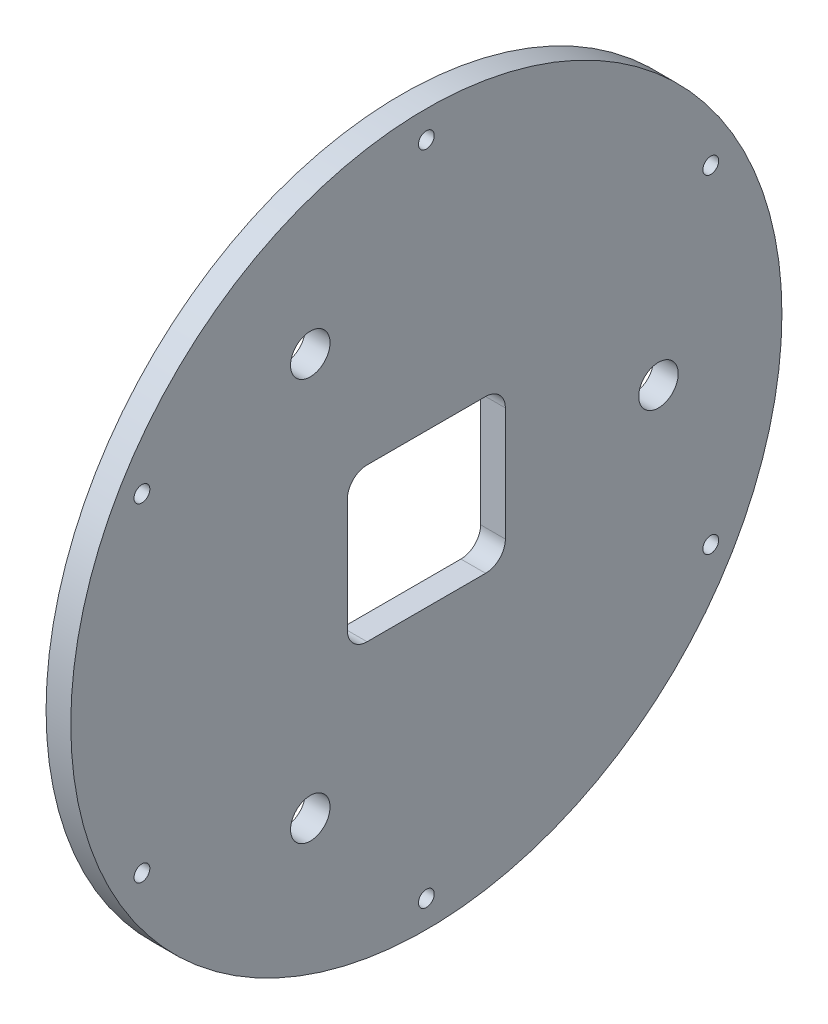
ISO-10303-21;
HEADER;
FILE_DESCRIPTION(('STEP AP214'),'2;1');
FILE_NAME('part.step','',(''),(''),'','','');
FILE_SCHEMA(('AUTOMOTIVE_DESIGN { 1 0 10303 214 1 1 1 1 }'));
ENDSEC;
DATA;
#1=APPLICATION_CONTEXT('core data for automotive mechanical design processes');
#2=APPLICATION_PROTOCOL_DEFINITION('international standard','automotive_design',2000,#1);
#3=PRODUCT_CONTEXT('',#1,'mechanical');
#4=PRODUCT('Part','Part','',(#3));
#5=PRODUCT_RELATED_PRODUCT_CATEGORY('part','',(#4));
#6=PRODUCT_DEFINITION_FORMATION('','',#4);
#7=PRODUCT_DEFINITION_CONTEXT('part definition',#1,'design');
#8=PRODUCT_DEFINITION('design','',#6,#7);
#9=PRODUCT_DEFINITION_SHAPE('','',#8);
#10=(LENGTH_UNIT() NAMED_UNIT(*) SI_UNIT(.MILLI.,.METRE.));
#11=(NAMED_UNIT(*) PLANE_ANGLE_UNIT() SI_UNIT($,.RADIAN.));
#12=(NAMED_UNIT(*) SI_UNIT($,.STERADIAN.) SOLID_ANGLE_UNIT());
#13=UNCERTAINTY_MEASURE_WITH_UNIT(LENGTH_MEASURE(1.E-05),#10,'distance_accuracy_value','');
#14=(GEOMETRIC_REPRESENTATION_CONTEXT(3) GLOBAL_UNCERTAINTY_ASSIGNED_CONTEXT((#13)) GLOBAL_UNIT_ASSIGNED_CONTEXT((#10,
#11,#12)) REPRESENTATION_CONTEXT('',''));
#15=CARTESIAN_POINT('',(0.,0.,0.));
#16=DIRECTION('',(0.,0.,1.));
#17=DIRECTION('',(1.,0.,0.));
#18=AXIS2_PLACEMENT_3D('',#15,#16,#17);
#19=CARTESIAN_POINT('',(5.,0.,0.));
#20=DIRECTION('',(1.,0.,0.));
#21=DIRECTION('',(0.,0.,-1.));
#22=AXIS2_PLACEMENT_3D('',#19,#20,#21);
#23=PLANE('',#22);
#24=CARTESIAN_POINT('',(5.,33.25,-57.5906893516652));
#25=DIRECTION('',(1.,0.,0.));
#26=DIRECTION('',(0.,0.,-1.));
#27=AXIS2_PLACEMENT_3D('',#24,#25,#26);
#28=CIRCLE('',#27,1.6);
#29=CARTESIAN_POINT('',(5.,33.25,-59.1906893516652));
#30=VERTEX_POINT('',#29);
#31=EDGE_CURVE('E166',#30,#30,#28,.T.);
#32=ORIENTED_EDGE('',*,*,#31,.F.);
#33=EDGE_LOOP('',(#32));
#34=FACE_BOUND('',#33,.T.);
#35=CARTESIAN_POINT('',(5.,-33.25,-57.5906893516652));
#36=DIRECTION('',(1.,0.,0.));
#37=DIRECTION('',(0.,0.,-1.));
#38=AXIS2_PLACEMENT_3D('',#35,#36,#37);
#39=CIRCLE('',#38,1.6);
#40=CARTESIAN_POINT('',(5.,-33.25,-59.1906893516652));
#41=VERTEX_POINT('',#40);
#42=EDGE_CURVE('E173',#41,#41,#39,.T.);
#43=ORIENTED_EDGE('',*,*,#42,.F.);
#44=EDGE_LOOP('',(#43));
#45=FACE_BOUND('',#44,.T.);
#46=CARTESIAN_POINT('',(5.,-66.5,0.));
#47=DIRECTION('',(1.,0.,0.));
#48=DIRECTION('',(0.,0.,-1.));
#49=AXIS2_PLACEMENT_3D('',#46,#47,#48);
#50=CIRCLE('',#49,1.6);
#51=CARTESIAN_POINT('',(5.,-66.5,-1.60000000000001));
#52=VERTEX_POINT('',#51);
#53=EDGE_CURVE('E179',#52,#52,#50,.T.);
#54=ORIENTED_EDGE('',*,*,#53,.F.);
#55=EDGE_LOOP('',(#54));
#56=FACE_BOUND('',#55,.T.);
#57=CARTESIAN_POINT('',(5.,-33.25,57.5906893516652));
#58=DIRECTION('',(1.,0.,0.));
#59=DIRECTION('',(0.,0.,-1.));
#60=AXIS2_PLACEMENT_3D('',#57,#58,#59);
#61=CIRCLE('',#60,1.6);
#62=CARTESIAN_POINT('',(5.,-33.25,55.9906893516652));
#63=VERTEX_POINT('',#62);
#64=EDGE_CURVE('E185',#63,#63,#61,.T.);
#65=ORIENTED_EDGE('',*,*,#64,.F.);
#66=EDGE_LOOP('',(#65));
#67=FACE_BOUND('',#66,.T.);
#68=CARTESIAN_POINT('',(5.,33.25,57.5906893516652));
#69=DIRECTION('',(1.,0.,0.));
#70=DIRECTION('',(0.,0.,-1.));
#71=AXIS2_PLACEMENT_3D('',#68,#69,#70);
#72=CIRCLE('',#71,1.6);
#73=CARTESIAN_POINT('',(5.,33.25,55.9906893516652));
#74=VERTEX_POINT('',#73);
#75=EDGE_CURVE('E191',#74,#74,#72,.T.);
#76=ORIENTED_EDGE('',*,*,#75,.F.);
#77=EDGE_LOOP('',(#76));
#78=FACE_BOUND('',#77,.T.);
#79=CARTESIAN_POINT('',(5.,66.5,0.));
#80=DIRECTION('',(1.,0.,0.));
#81=DIRECTION('',(0.,0.,-1.));
#82=AXIS2_PLACEMENT_3D('',#79,#80,#81);
#83=CIRCLE('',#82,1.6);
#84=CARTESIAN_POINT('',(5.,66.5,-1.6));
#85=VERTEX_POINT('',#84);
#86=EDGE_CURVE('E196',#85,#85,#83,.T.);
#87=ORIENTED_EDGE('',*,*,#86,.F.);
#88=EDGE_LOOP('',(#87));
#89=FACE_BOUND('',#88,.T.);
#90=CARTESIAN_POINT('',(5.,-40.7031939778686,23.5));
#91=DIRECTION('',(1.,0.,0.));
#92=DIRECTION('',(0.,0.,-1.));
#93=AXIS2_PLACEMENT_3D('',#90,#91,#92);
#94=CIRCLE('',#93,4.);
#95=CARTESIAN_POINT('',(5.,-40.7031939778686,19.5));
#96=VERTEX_POINT('',#95);
#97=EDGE_CURVE('E202',#96,#96,#94,.T.);
#98=ORIENTED_EDGE('',*,*,#97,.F.);
#99=EDGE_LOOP('',(#98));
#100=FACE_BOUND('',#99,.T.);
#101=CARTESIAN_POINT('',(5.,40.7031939778686,23.5));
#102=DIRECTION('',(1.,0.,0.));
#103=DIRECTION('',(0.,0.,-1.));
#104=AXIS2_PLACEMENT_3D('',#101,#102,#103);
#105=CIRCLE('',#104,4.);
#106=CARTESIAN_POINT('',(5.,40.7031939778686,19.5));
#107=VERTEX_POINT('',#106);
#108=EDGE_CURVE('E209',#107,#107,#105,.T.);
#109=ORIENTED_EDGE('',*,*,#108,.F.);
#110=EDGE_LOOP('',(#109));
#111=FACE_BOUND('',#110,.T.);
#112=CARTESIAN_POINT('',(5.,0.,-47.));
#113=DIRECTION('',(1.,0.,0.));
#114=DIRECTION('',(0.,0.,-1.));
#115=AXIS2_PLACEMENT_3D('',#112,#113,#114);
#116=CIRCLE('',#115,4.00000000000001);
#117=CARTESIAN_POINT('',(5.,0.,-51.));
#118=VERTEX_POINT('',#117);
#119=EDGE_CURVE('E214',#118,#118,#116,.T.);
#120=ORIENTED_EDGE('',*,*,#119,.F.);
#121=EDGE_LOOP('',(#120));
#122=FACE_BOUND('',#121,.T.);
#123=CARTESIAN_POINT('',(5.,0.,0.));
#124=DIRECTION('',(1.,0.,0.));
#125=DIRECTION('',(0.,0.,-1.));
#126=AXIS2_PLACEMENT_3D('',#123,#124,#125);
#127=CIRCLE('',#126,72.);
#128=CARTESIAN_POINT('',(5.,0.,-72.));
#129=VERTEX_POINT('',#128);
#130=EDGE_CURVE('E11',#129,#129,#127,.T.);
#131=ORIENTED_EDGE('',*,*,#130,.T.);
#132=EDGE_LOOP('',(#131));
#133=FACE_BOUND('',#132,.T.);
#134=DIRECTION('',(0.,0.,-1.));
#135=VECTOR('',#134,1.);
#136=CARTESIAN_POINT('',(5.,-15.5,12.));
#137=LINE('',#136,#135);
#138=CARTESIAN_POINT('',(5.,-15.5,12.));
#139=VERTEX_POINT('',#138);
#140=CARTESIAN_POINT('',(5.,-15.5,-12.));
#141=VERTEX_POINT('',#140);
#142=EDGE_CURVE('E109',#139,#141,#137,.T.);
#143=ORIENTED_EDGE('',*,*,#142,.F.);
#144=CARTESIAN_POINT('',(5.,-11.5,12.));
#145=DIRECTION('',(1.,0.,0.));
#146=DIRECTION('',(0.,0.,1.));
#147=AXIS2_PLACEMENT_3D('',#144,#145,#146);
#148=CIRCLE('',#147,4.);
#149=CARTESIAN_POINT('',(5.,-11.5,16.));
#150=VERTEX_POINT('',#149);
#151=EDGE_CURVE('E101',#150,#139,#148,.T.);
#152=ORIENTED_EDGE('',*,*,#151,.F.);
#153=DIRECTION('',(0.,-1.,0.));
#154=VECTOR('',#153,1.);
#155=CARTESIAN_POINT('',(5.,11.5,16.));
#156=LINE('',#155,#154);
#157=CARTESIAN_POINT('',(5.,11.5,16.));
#158=VERTEX_POINT('',#157);
#159=EDGE_CURVE('E134',#158,#150,#156,.T.);
#160=ORIENTED_EDGE('',*,*,#159,.F.);
#161=CARTESIAN_POINT('',(5.,11.5,12.));
#162=DIRECTION('',(1.,0.,0.));
#163=DIRECTION('',(0.,0.,-1.));
#164=AXIS2_PLACEMENT_3D('',#161,#162,#163);
#165=CIRCLE('',#164,4.);
#166=CARTESIAN_POINT('',(5.,15.5,12.));
#167=VERTEX_POINT('',#166);
#168=EDGE_CURVE('E132',#167,#158,#165,.T.);
#169=ORIENTED_EDGE('',*,*,#168,.F.);
#170=DIRECTION('',(0.,0.,1.));
#171=VECTOR('',#170,1.);
#172=CARTESIAN_POINT('',(5.,15.5,12.));
#173=LINE('',#172,#171);
#174=CARTESIAN_POINT('',(5.,15.5,-12.));
#175=VERTEX_POINT('',#174);
#176=EDGE_CURVE('E130',#175,#167,#173,.T.);
#177=ORIENTED_EDGE('',*,*,#176,.F.);
#178=CARTESIAN_POINT('',(5.,11.5,-12.));
#179=DIRECTION('',(1.,0.,0.));
#180=DIRECTION('',(0.,0.,-1.));
#181=AXIS2_PLACEMENT_3D('',#178,#179,#180);
#182=CIRCLE('',#181,4.);
#183=CARTESIAN_POINT('',(5.,11.5,-16.));
#184=VERTEX_POINT('',#183);
#185=EDGE_CURVE('E128',#184,#175,#182,.T.);
#186=ORIENTED_EDGE('',*,*,#185,.F.);
#187=DIRECTION('',(0.,1.,0.));
#188=VECTOR('',#187,1.);
#189=CARTESIAN_POINT('',(5.,11.5,-16.));
#190=LINE('',#189,#188);
#191=CARTESIAN_POINT('',(5.,-11.5,-16.));
#192=VERTEX_POINT('',#191);
#193=EDGE_CURVE('E124',#192,#184,#190,.T.);
#194=ORIENTED_EDGE('',*,*,#193,.F.);
#195=CARTESIAN_POINT('',(5.,-11.5,-12.));
#196=DIRECTION('',(1.,0.,0.));
#197=DIRECTION('',(0.,0.,-1.));
#198=AXIS2_PLACEMENT_3D('',#195,#196,#197);
#199=CIRCLE('',#198,4.);
#200=EDGE_CURVE('E122',#141,#192,#199,.T.);
#201=ORIENTED_EDGE('',*,*,#200,.F.);
#202=EDGE_LOOP('',(#143,#152,#160,#169,#177,#186,#194,#201));
#203=FACE_BOUND('',#202,.T.);
#204=ADVANCED_FACE('F36',(#34,#45,#56,#67,#78,#89,#100,#111,#122,#133,#203),#23,.T.);
#205=CARTESIAN_POINT('',(0.,0.,0.));
#206=DIRECTION('',(1.,0.,0.));
#207=DIRECTION('',(0.,0.,-1.));
#208=AXIS2_PLACEMENT_3D('',#205,#206,#207);
#209=PLANE('',#208);
#210=CARTESIAN_POINT('',(0.,0.,0.));
#211=DIRECTION('',(1.,0.,0.));
#212=DIRECTION('',(0.,0.,-1.));
#213=AXIS2_PLACEMENT_3D('',#210,#211,#212);
#214=CIRCLE('',#213,72.);
#215=CARTESIAN_POINT('',(0.,0.,-72.));
#216=VERTEX_POINT('',#215);
#217=EDGE_CURVE('E40',#216,#216,#214,.T.);
#218=ORIENTED_EDGE('',*,*,#217,.F.);
#219=EDGE_LOOP('',(#218));
#220=FACE_BOUND('',#219,.T.);
#221=CARTESIAN_POINT('',(0.,0.,-47.));
#222=DIRECTION('',(1.,0.,0.));
#223=DIRECTION('',(0.,0.,-1.));
#224=AXIS2_PLACEMENT_3D('',#221,#222,#223);
#225=CIRCLE('',#224,4.00000000000001);
#226=CARTESIAN_POINT('',(0.,0.,-51.));
#227=VERTEX_POINT('',#226);
#228=EDGE_CURVE('E205',#227,#227,#225,.T.);
#229=ORIENTED_EDGE('',*,*,#228,.T.);
#230=EDGE_LOOP('',(#229));
#231=FACE_BOUND('',#230,.T.);
#232=CARTESIAN_POINT('',(0.,40.7031939778686,23.5));
#233=DIRECTION('',(1.,0.,0.));
#234=DIRECTION('',(0.,0.,-1.));
#235=AXIS2_PLACEMENT_3D('',#232,#233,#234);
#236=CIRCLE('',#235,4.);
#237=CARTESIAN_POINT('',(0.,40.7031939778686,19.5));
#238=VERTEX_POINT('',#237);
#239=EDGE_CURVE('E199',#238,#238,#236,.T.);
#240=ORIENTED_EDGE('',*,*,#239,.T.);
#241=EDGE_LOOP('',(#240));
#242=FACE_BOUND('',#241,.T.);
#243=CARTESIAN_POINT('',(0.,-40.7031939778686,23.5));
#244=DIRECTION('',(1.,0.,0.));
#245=DIRECTION('',(0.,0.,-1.));
#246=AXIS2_PLACEMENT_3D('',#243,#244,#245);
#247=CIRCLE('',#246,4.);
#248=CARTESIAN_POINT('',(0.,-40.7031939778686,19.5));
#249=VERTEX_POINT('',#248);
#250=EDGE_CURVE('E206',#249,#249,#247,.T.);
#251=ORIENTED_EDGE('',*,*,#250,.T.);
#252=EDGE_LOOP('',(#251));
#253=FACE_BOUND('',#252,.T.);
#254=CARTESIAN_POINT('',(0.,66.5,0.));
#255=DIRECTION('',(1.,0.,0.));
#256=DIRECTION('',(0.,0.,-1.));
#257=AXIS2_PLACEMENT_3D('',#254,#255,#256);
#258=CIRCLE('',#257,1.6);
#259=CARTESIAN_POINT('',(0.,66.5,-1.6));
#260=VERTEX_POINT('',#259);
#261=EDGE_CURVE('E169',#260,#260,#258,.T.);
#262=ORIENTED_EDGE('',*,*,#261,.T.);
#263=EDGE_LOOP('',(#262));
#264=FACE_BOUND('',#263,.T.);
#265=CARTESIAN_POINT('',(0.,33.25,57.5906893516652));
#266=DIRECTION('',(1.,0.,0.));
#267=DIRECTION('',(0.,0.,-1.));
#268=AXIS2_PLACEMENT_3D('',#265,#266,#267);
#269=CIRCLE('',#268,1.6);
#270=CARTESIAN_POINT('',(0.,33.25,55.9906893516652));
#271=VERTEX_POINT('',#270);
#272=EDGE_CURVE('E117',#271,#271,#269,.T.);
#273=ORIENTED_EDGE('',*,*,#272,.T.);
#274=EDGE_LOOP('',(#273));
#275=FACE_BOUND('',#274,.T.);
#276=CARTESIAN_POINT('',(0.,-33.25,57.5906893516652));
#277=DIRECTION('',(1.,0.,0.));
#278=DIRECTION('',(0.,0.,-1.));
#279=AXIS2_PLACEMENT_3D('',#276,#277,#278);
#280=CIRCLE('',#279,1.6);
#281=CARTESIAN_POINT('',(0.,-33.25,55.9906893516652));
#282=VERTEX_POINT('',#281);
#283=EDGE_CURVE('E188',#282,#282,#280,.T.);
#284=ORIENTED_EDGE('',*,*,#283,.T.);
#285=EDGE_LOOP('',(#284));
#286=FACE_BOUND('',#285,.T.);
#287=CARTESIAN_POINT('',(0.,-66.5,0.));
#288=DIRECTION('',(1.,0.,0.));
#289=DIRECTION('',(0.,0.,-1.));
#290=AXIS2_PLACEMENT_3D('',#287,#288,#289);
#291=CIRCLE('',#290,1.6);
#292=CARTESIAN_POINT('',(0.,-66.5,-1.60000000000001));
#293=VERTEX_POINT('',#292);
#294=EDGE_CURVE('E182',#293,#293,#291,.T.);
#295=ORIENTED_EDGE('',*,*,#294,.T.);
#296=EDGE_LOOP('',(#295));
#297=FACE_BOUND('',#296,.T.);
#298=CARTESIAN_POINT('',(0.,-33.25,-57.5906893516652));
#299=DIRECTION('',(1.,0.,0.));
#300=DIRECTION('',(0.,0.,-1.));
#301=AXIS2_PLACEMENT_3D('',#298,#299,#300);
#302=CIRCLE('',#301,1.6);
#303=CARTESIAN_POINT('',(0.,-33.25,-59.1906893516652));
#304=VERTEX_POINT('',#303);
#305=EDGE_CURVE('E176',#304,#304,#302,.T.);
#306=ORIENTED_EDGE('',*,*,#305,.T.);
#307=EDGE_LOOP('',(#306));
#308=FACE_BOUND('',#307,.T.);
#309=CARTESIAN_POINT('',(0.,33.25,-57.5906893516652));
#310=DIRECTION('',(1.,0.,0.));
#311=DIRECTION('',(0.,0.,-1.));
#312=AXIS2_PLACEMENT_3D('',#309,#310,#311);
#313=CIRCLE('',#312,1.6);
#314=CARTESIAN_POINT('',(0.,33.25,-59.1906893516652));
#315=VERTEX_POINT('',#314);
#316=EDGE_CURVE('E170',#315,#315,#313,.T.);
#317=ORIENTED_EDGE('',*,*,#316,.T.);
#318=EDGE_LOOP('',(#317));
#319=FACE_BOUND('',#318,.T.);
#320=CARTESIAN_POINT('',(0.,-11.5,12.));
#321=DIRECTION('',(1.,0.,0.));
#322=DIRECTION('',(0.,0.,1.));
#323=AXIS2_PLACEMENT_3D('',#320,#321,#322);
#324=CIRCLE('',#323,4.);
#325=CARTESIAN_POINT('',(0.,-11.5,16.));
#326=VERTEX_POINT('',#325);
#327=CARTESIAN_POINT('',(0.,-15.5,12.));
#328=VERTEX_POINT('',#327);
#329=EDGE_CURVE('E59',#326,#328,#324,.T.);
#330=ORIENTED_EDGE('',*,*,#329,.T.);
#331=DIRECTION('',(0.,0.,-1.));
#332=VECTOR('',#331,1.);
#333=CARTESIAN_POINT('',(0.,-15.5,12.));
#334=LINE('',#333,#332);
#335=CARTESIAN_POINT('',(0.,-15.5,-12.));
#336=VERTEX_POINT('',#335);
#337=EDGE_CURVE('E116',#328,#336,#334,.T.);
#338=ORIENTED_EDGE('',*,*,#337,.T.);
#339=CARTESIAN_POINT('',(0.,-11.5,-12.));
#340=DIRECTION('',(1.,0.,0.));
#341=DIRECTION('',(0.,0.,-1.));
#342=AXIS2_PLACEMENT_3D('',#339,#340,#341);
#343=CIRCLE('',#342,4.);
#344=CARTESIAN_POINT('',(0.,-11.5,-16.));
#345=VERTEX_POINT('',#344);
#346=EDGE_CURVE('E138',#336,#345,#343,.T.);
#347=ORIENTED_EDGE('',*,*,#346,.T.);
#348=DIRECTION('',(0.,1.,0.));
#349=VECTOR('',#348,1.);
#350=CARTESIAN_POINT('',(0.,11.5,-16.));
#351=LINE('',#350,#349);
#352=CARTESIAN_POINT('',(0.,11.5,-16.));
#353=VERTEX_POINT('',#352);
#354=EDGE_CURVE('E141',#345,#353,#351,.T.);
#355=ORIENTED_EDGE('',*,*,#354,.T.);
#356=CARTESIAN_POINT('',(0.,11.5,-12.));
#357=DIRECTION('',(1.,0.,0.));
#358=DIRECTION('',(0.,0.,-1.));
#359=AXIS2_PLACEMENT_3D('',#356,#357,#358);
#360=CIRCLE('',#359,4.);
#361=CARTESIAN_POINT('',(0.,15.5,-12.));
#362=VERTEX_POINT('',#361);
#363=EDGE_CURVE('E144',#353,#362,#360,.T.);
#364=ORIENTED_EDGE('',*,*,#363,.T.);
#365=DIRECTION('',(0.,0.,1.));
#366=VECTOR('',#365,1.);
#367=CARTESIAN_POINT('',(0.,15.5,12.));
#368=LINE('',#367,#366);
#369=CARTESIAN_POINT('',(0.,15.5,12.));
#370=VERTEX_POINT('',#369);
#371=EDGE_CURVE('E147',#362,#370,#368,.T.);
#372=ORIENTED_EDGE('',*,*,#371,.T.);
#373=CARTESIAN_POINT('',(0.,11.5,12.));
#374=DIRECTION('',(1.,0.,0.));
#375=DIRECTION('',(0.,0.,-1.));
#376=AXIS2_PLACEMENT_3D('',#373,#374,#375);
#377=CIRCLE('',#376,4.);
#378=CARTESIAN_POINT('',(0.,11.5,16.));
#379=VERTEX_POINT('',#378);
#380=EDGE_CURVE('E150',#370,#379,#377,.T.);
#381=ORIENTED_EDGE('',*,*,#380,.T.);
#382=DIRECTION('',(0.,-1.,0.));
#383=VECTOR('',#382,1.);
#384=CARTESIAN_POINT('',(0.,11.5,16.));
#385=LINE('',#384,#383);
#386=EDGE_CURVE('E110',#379,#326,#385,.T.);
#387=ORIENTED_EDGE('',*,*,#386,.T.);
#388=EDGE_LOOP('',(#330,#338,#347,#355,#364,#372,#381,#387));
#389=FACE_BOUND('',#388,.T.);
#390=ADVANCED_FACE('F220',(#220,#231,#242,#253,#264,#275,#286,#297,#308,#319,#389),#209,.F.);
#391=CARTESIAN_POINT('',(5.,0.,0.));
#392=DIRECTION('',(-1.,0.,0.));
#393=DIRECTION('',(0.,0.,1.));
#394=AXIS2_PLACEMENT_3D('',#391,#392,#393);
#395=CYLINDRICAL_SURFACE('',#394,72.);
#396=ORIENTED_EDGE('',*,*,#130,.F.);
#397=EDGE_LOOP('',(#396));
#398=FACE_BOUND('',#397,.T.);
#399=ORIENTED_EDGE('',*,*,#217,.T.);
#400=EDGE_LOOP('',(#399));
#401=FACE_BOUND('',#400,.T.);
#402=ADVANCED_FACE('F38',(#398,#401),#395,.T.);
#403=CARTESIAN_POINT('',(5.,0.,-47.));
#404=DIRECTION('',(-1.,0.,0.));
#405=DIRECTION('',(0.,0.,1.));
#406=AXIS2_PLACEMENT_3D('',#403,#404,#405);
#407=CYLINDRICAL_SURFACE('',#406,4.00000000000001);
#408=ORIENTED_EDGE('',*,*,#119,.T.);
#409=EDGE_LOOP('',(#408));
#410=FACE_BOUND('',#409,.T.);
#411=ORIENTED_EDGE('',*,*,#228,.F.);
#412=EDGE_LOOP('',(#411));
#413=FACE_BOUND('',#412,.T.);
#414=ADVANCED_FACE('F223',(#410,#413),#407,.F.);
#415=CARTESIAN_POINT('',(5.,40.7031939778686,23.5));
#416=DIRECTION('',(-1.,0.,0.));
#417=DIRECTION('',(0.,0.,1.));
#418=AXIS2_PLACEMENT_3D('',#415,#416,#417);
#419=CYLINDRICAL_SURFACE('',#418,4.);
#420=ORIENTED_EDGE('',*,*,#108,.T.);
#421=EDGE_LOOP('',(#420));
#422=FACE_BOUND('',#421,.T.);
#423=ORIENTED_EDGE('',*,*,#239,.F.);
#424=EDGE_LOOP('',(#423));
#425=FACE_BOUND('',#424,.T.);
#426=ADVANCED_FACE('F225',(#422,#425),#419,.F.);
#427=CARTESIAN_POINT('',(5.,-40.7031939778686,23.5));
#428=DIRECTION('',(-1.,0.,0.));
#429=DIRECTION('',(0.,0.,1.));
#430=AXIS2_PLACEMENT_3D('',#427,#428,#429);
#431=CYLINDRICAL_SURFACE('',#430,4.);
#432=ORIENTED_EDGE('',*,*,#97,.T.);
#433=EDGE_LOOP('',(#432));
#434=FACE_BOUND('',#433,.T.);
#435=ORIENTED_EDGE('',*,*,#250,.F.);
#436=EDGE_LOOP('',(#435));
#437=FACE_BOUND('',#436,.T.);
#438=ADVANCED_FACE('F232',(#434,#437),#431,.F.);
#439=CARTESIAN_POINT('',(5.,66.5,0.));
#440=DIRECTION('',(-1.,0.,0.));
#441=DIRECTION('',(0.,0.,1.));
#442=AXIS2_PLACEMENT_3D('',#439,#440,#441);
#443=CYLINDRICAL_SURFACE('',#442,1.6);
#444=ORIENTED_EDGE('',*,*,#86,.T.);
#445=EDGE_LOOP('',(#444));
#446=FACE_BOUND('',#445,.T.);
#447=ORIENTED_EDGE('',*,*,#261,.F.);
#448=EDGE_LOOP('',(#447));
#449=FACE_BOUND('',#448,.T.);
#450=ADVANCED_FACE('F336',(#446,#449),#443,.F.);
#451=CARTESIAN_POINT('',(5.,33.25,57.5906893516652));
#452=DIRECTION('',(-1.,0.,0.));
#453=DIRECTION('',(0.,0.,1.));
#454=AXIS2_PLACEMENT_3D('',#451,#452,#453);
#455=CYLINDRICAL_SURFACE('',#454,1.6);
#456=ORIENTED_EDGE('',*,*,#75,.T.);
#457=EDGE_LOOP('',(#456));
#458=FACE_BOUND('',#457,.T.);
#459=ORIENTED_EDGE('',*,*,#272,.F.);
#460=EDGE_LOOP('',(#459));
#461=FACE_BOUND('',#460,.T.);
#462=ADVANCED_FACE('F332',(#458,#461),#455,.F.);
#463=CARTESIAN_POINT('',(5.,-33.25,57.5906893516652));
#464=DIRECTION('',(-1.,0.,0.));
#465=DIRECTION('',(0.,0.,1.));
#466=AXIS2_PLACEMENT_3D('',#463,#464,#465);
#467=CYLINDRICAL_SURFACE('',#466,1.6);
#468=ORIENTED_EDGE('',*,*,#64,.T.);
#469=EDGE_LOOP('',(#468));
#470=FACE_BOUND('',#469,.T.);
#471=ORIENTED_EDGE('',*,*,#283,.F.);
#472=EDGE_LOOP('',(#471));
#473=FACE_BOUND('',#472,.T.);
#474=ADVANCED_FACE('F328',(#470,#473),#467,.F.);
#475=CARTESIAN_POINT('',(5.,-66.5,0.));
#476=DIRECTION('',(-1.,0.,0.));
#477=DIRECTION('',(0.,0.,1.));
#478=AXIS2_PLACEMENT_3D('',#475,#476,#477);
#479=CYLINDRICAL_SURFACE('',#478,1.6);
#480=ORIENTED_EDGE('',*,*,#53,.T.);
#481=EDGE_LOOP('',(#480));
#482=FACE_BOUND('',#481,.T.);
#483=ORIENTED_EDGE('',*,*,#294,.F.);
#484=EDGE_LOOP('',(#483));
#485=FACE_BOUND('',#484,.T.);
#486=ADVANCED_FACE('F324',(#482,#485),#479,.F.);
#487=CARTESIAN_POINT('',(5.,-33.25,-57.5906893516652));
#488=DIRECTION('',(-1.,0.,0.));
#489=DIRECTION('',(0.,0.,1.));
#490=AXIS2_PLACEMENT_3D('',#487,#488,#489);
#491=CYLINDRICAL_SURFACE('',#490,1.6);
#492=ORIENTED_EDGE('',*,*,#42,.T.);
#493=EDGE_LOOP('',(#492));
#494=FACE_BOUND('',#493,.T.);
#495=ORIENTED_EDGE('',*,*,#305,.F.);
#496=EDGE_LOOP('',(#495));
#497=FACE_BOUND('',#496,.T.);
#498=ADVANCED_FACE('F320',(#494,#497),#491,.F.);
#499=CARTESIAN_POINT('',(5.,33.25,-57.5906893516652));
#500=DIRECTION('',(-1.,0.,0.));
#501=DIRECTION('',(0.,0.,1.));
#502=AXIS2_PLACEMENT_3D('',#499,#500,#501);
#503=CYLINDRICAL_SURFACE('',#502,1.6);
#504=ORIENTED_EDGE('',*,*,#31,.T.);
#505=EDGE_LOOP('',(#504));
#506=FACE_BOUND('',#505,.T.);
#507=ORIENTED_EDGE('',*,*,#316,.F.);
#508=EDGE_LOOP('',(#507));
#509=FACE_BOUND('',#508,.T.);
#510=ADVANCED_FACE('F317',(#506,#509),#503,.F.);
#511=CARTESIAN_POINT('',(5.,-11.5,12.));
#512=DIRECTION('',(-1.,0.,0.));
#513=DIRECTION('',(0.,0.,1.));
#514=AXIS2_PLACEMENT_3D('',#511,#512,#513);
#515=CYLINDRICAL_SURFACE('',#514,4.);
#516=ORIENTED_EDGE('',*,*,#329,.F.);
#517=DIRECTION('',(-1.,0.,0.));
#518=VECTOR('',#517,1.);
#519=CARTESIAN_POINT('',(5.,-11.5,16.));
#520=LINE('',#519,#518);
#521=EDGE_CURVE('E105',#150,#326,#520,.T.);
#522=ORIENTED_EDGE('',*,*,#521,.F.);
#523=ORIENTED_EDGE('',*,*,#151,.T.);
#524=DIRECTION('',(-1.,0.,0.));
#525=VECTOR('',#524,1.);
#526=CARTESIAN_POINT('',(5.,-15.5,12.));
#527=LINE('',#526,#525);
#528=EDGE_CURVE('E104',#139,#328,#527,.T.);
#529=ORIENTED_EDGE('',*,*,#528,.T.);
#530=EDGE_LOOP('',(#516,#522,#523,#529));
#531=FACE_BOUND('',#530,.T.);
#532=ADVANCED_FACE('F103',(#531),#515,.F.);
#533=CARTESIAN_POINT('',(5.,-15.5,12.));
#534=DIRECTION('',(0.,1.,0.));
#535=DIRECTION('',(0.,0.,1.));
#536=AXIS2_PLACEMENT_3D('',#533,#534,#535);
#537=PLANE('',#536);
#538=ORIENTED_EDGE('',*,*,#337,.F.);
#539=ORIENTED_EDGE('',*,*,#528,.F.);
#540=ORIENTED_EDGE('',*,*,#142,.T.);
#541=DIRECTION('',(-1.,0.,0.));
#542=VECTOR('',#541,1.);
#543=CARTESIAN_POINT('',(5.,-15.5,-12.));
#544=LINE('',#543,#542);
#545=EDGE_CURVE('E118',#141,#336,#544,.T.);
#546=ORIENTED_EDGE('',*,*,#545,.T.);
#547=EDGE_LOOP('',(#538,#539,#540,#546));
#548=FACE_BOUND('',#547,.T.);
#549=ADVANCED_FACE('F113',(#548),#537,.T.);
#550=CARTESIAN_POINT('',(5.,-11.5,-12.));
#551=DIRECTION('',(-1.,0.,0.));
#552=DIRECTION('',(0.,0.,1.));
#553=AXIS2_PLACEMENT_3D('',#550,#551,#552);
#554=CYLINDRICAL_SURFACE('',#553,4.);
#555=ORIENTED_EDGE('',*,*,#346,.F.);
#556=ORIENTED_EDGE('',*,*,#545,.F.);
#557=ORIENTED_EDGE('',*,*,#200,.T.);
#558=DIRECTION('',(-1.,0.,0.));
#559=VECTOR('',#558,1.);
#560=CARTESIAN_POINT('',(5.,-11.5,-16.));
#561=LINE('',#560,#559);
#562=EDGE_CURVE('E163',#192,#345,#561,.T.);
#563=ORIENTED_EDGE('',*,*,#562,.T.);
#564=EDGE_LOOP('',(#555,#556,#557,#563));
#565=FACE_BOUND('',#564,.T.);
#566=ADVANCED_FACE('F304',(#565),#554,.F.);
#567=CARTESIAN_POINT('',(5.,11.5,-16.));
#568=DIRECTION('',(0.,0.,1.));
#569=DIRECTION('',(1.,0.,0.));
#570=AXIS2_PLACEMENT_3D('',#567,#568,#569);
#571=PLANE('',#570);
#572=ORIENTED_EDGE('',*,*,#354,.F.);
#573=ORIENTED_EDGE('',*,*,#562,.F.);
#574=ORIENTED_EDGE('',*,*,#193,.T.);
#575=DIRECTION('',(-1.,0.,0.));
#576=VECTOR('',#575,1.);
#577=CARTESIAN_POINT('',(5.,11.5,-16.));
#578=LINE('',#577,#576);
#579=EDGE_CURVE('E161',#184,#353,#578,.T.);
#580=ORIENTED_EDGE('',*,*,#579,.T.);
#581=EDGE_LOOP('',(#572,#573,#574,#580));
#582=FACE_BOUND('',#581,.T.);
#583=ADVANCED_FACE('F301',(#582),#571,.T.);
#584=CARTESIAN_POINT('',(5.,11.5,-12.));
#585=DIRECTION('',(-1.,0.,0.));
#586=DIRECTION('',(0.,0.,1.));
#587=AXIS2_PLACEMENT_3D('',#584,#585,#586);
#588=CYLINDRICAL_SURFACE('',#587,4.);
#589=ORIENTED_EDGE('',*,*,#363,.F.);
#590=ORIENTED_EDGE('',*,*,#579,.F.);
#591=ORIENTED_EDGE('',*,*,#185,.T.);
#592=DIRECTION('',(-1.,0.,0.));
#593=VECTOR('',#592,1.);
#594=CARTESIAN_POINT('',(5.,15.5,-12.));
#595=LINE('',#594,#593);
#596=EDGE_CURVE('E159',#175,#362,#595,.T.);
#597=ORIENTED_EDGE('',*,*,#596,.T.);
#598=EDGE_LOOP('',(#589,#590,#591,#597));
#599=FACE_BOUND('',#598,.T.);
#600=ADVANCED_FACE('F296',(#599),#588,.F.);
#601=CARTESIAN_POINT('',(5.,15.5,12.));
#602=DIRECTION('',(0.,-1.,0.));
#603=DIRECTION('',(0.,0.,-1.));
#604=AXIS2_PLACEMENT_3D('',#601,#602,#603);
#605=PLANE('',#604);
#606=ORIENTED_EDGE('',*,*,#371,.F.);
#607=ORIENTED_EDGE('',*,*,#596,.F.);
#608=ORIENTED_EDGE('',*,*,#176,.T.);
#609=DIRECTION('',(-1.,0.,0.));
#610=VECTOR('',#609,1.);
#611=CARTESIAN_POINT('',(5.,15.5,12.));
#612=LINE('',#611,#610);
#613=EDGE_CURVE('E157',#167,#370,#612,.T.);
#614=ORIENTED_EDGE('',*,*,#613,.T.);
#615=EDGE_LOOP('',(#606,#607,#608,#614));
#616=FACE_BOUND('',#615,.T.);
#617=ADVANCED_FACE('F292',(#616),#605,.T.);
#618=CARTESIAN_POINT('',(5.,11.5,12.));
#619=DIRECTION('',(-1.,0.,0.));
#620=DIRECTION('',(0.,0.,1.));
#621=AXIS2_PLACEMENT_3D('',#618,#619,#620);
#622=CYLINDRICAL_SURFACE('',#621,4.);
#623=ORIENTED_EDGE('',*,*,#380,.F.);
#624=ORIENTED_EDGE('',*,*,#613,.F.);
#625=ORIENTED_EDGE('',*,*,#168,.T.);
#626=DIRECTION('',(-1.,0.,0.));
#627=VECTOR('',#626,1.);
#628=CARTESIAN_POINT('',(5.,11.5,16.));
#629=LINE('',#628,#627);
#630=EDGE_CURVE('E51',#158,#379,#629,.T.);
#631=ORIENTED_EDGE('',*,*,#630,.T.);
#632=EDGE_LOOP('',(#623,#624,#625,#631));
#633=FACE_BOUND('',#632,.T.);
#634=ADVANCED_FACE('F289',(#633),#622,.F.);
#635=CARTESIAN_POINT('',(5.,11.5,16.));
#636=DIRECTION('',(0.,0.,-1.));
#637=DIRECTION('',(-1.,0.,0.));
#638=AXIS2_PLACEMENT_3D('',#635,#636,#637);
#639=PLANE('',#638);
#640=ORIENTED_EDGE('',*,*,#386,.F.);
#641=ORIENTED_EDGE('',*,*,#630,.F.);
#642=ORIENTED_EDGE('',*,*,#159,.T.);
#643=ORIENTED_EDGE('',*,*,#521,.T.);
#644=EDGE_LOOP('',(#640,#641,#642,#643));
#645=FACE_BOUND('',#644,.T.);
#646=ADVANCED_FACE('F283',(#645),#639,.T.);
#647=CLOSED_SHELL('',(#204,#390,#402,#414,#426,#438,#450,#462,#474,#486,#498,#510,#532,#549,
#566,#583,#600,#617,#634,#646));
#648=MANIFOLD_SOLID_BREP('B2',#647);
#649=ADVANCED_BREP_SHAPE_REPRESENTATION('',(#18,#648),#14);
#650=SHAPE_DEFINITION_REPRESENTATION(#9,#649);
ENDSEC;
END-ISO-10303-21;
